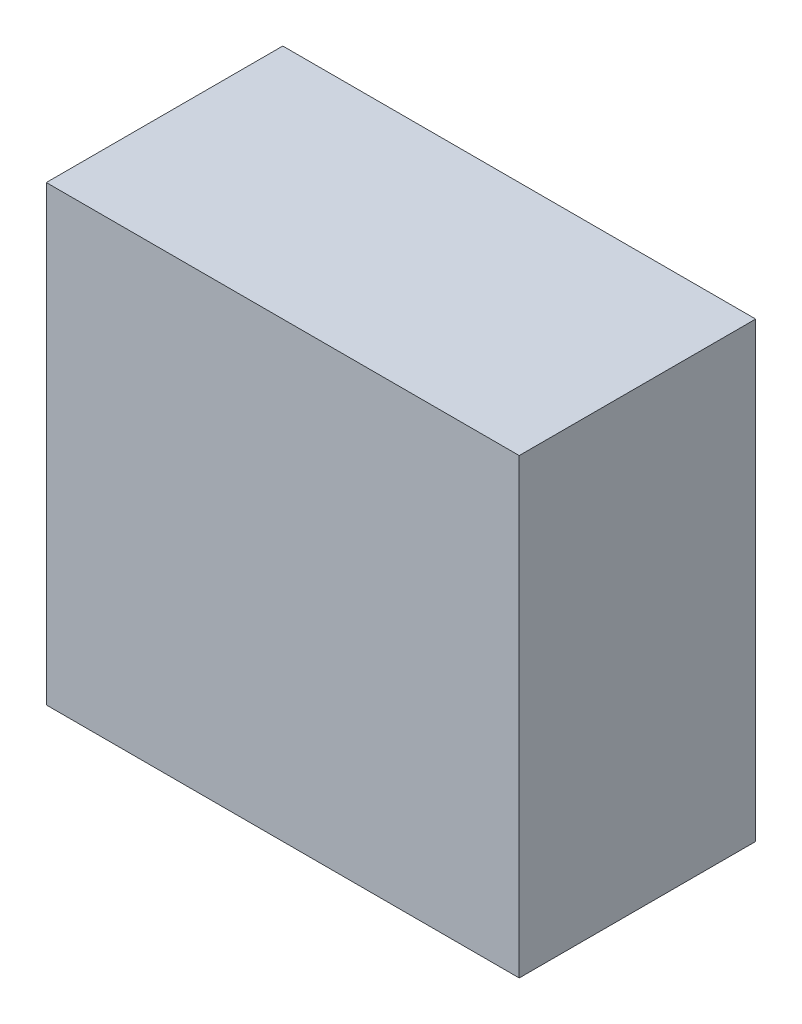
ISO-10303-21;
HEADER;
FILE_DESCRIPTION(('STEP AP214'),'2;1');
FILE_NAME('part.step','',(''),(''),'','','');
FILE_SCHEMA(('AUTOMOTIVE_DESIGN { 1 0 10303 214 1 1 1 1 }'));
ENDSEC;
DATA;
#1=APPLICATION_CONTEXT('core data for automotive mechanical design processes');
#2=APPLICATION_PROTOCOL_DEFINITION('international standard','automotive_design',2000,#1);
#3=PRODUCT_CONTEXT('',#1,'mechanical');
#4=PRODUCT('Part','Part','',(#3));
#5=PRODUCT_RELATED_PRODUCT_CATEGORY('part','',(#4));
#6=PRODUCT_DEFINITION_FORMATION('','',#4);
#7=PRODUCT_DEFINITION_CONTEXT('part definition',#1,'design');
#8=PRODUCT_DEFINITION('design','',#6,#7);
#9=PRODUCT_DEFINITION_SHAPE('','',#8);
#10=(LENGTH_UNIT() NAMED_UNIT(*) SI_UNIT(.MILLI.,.METRE.));
#11=(NAMED_UNIT(*) PLANE_ANGLE_UNIT() SI_UNIT($,.RADIAN.));
#12=(NAMED_UNIT(*) SI_UNIT($,.STERADIAN.) SOLID_ANGLE_UNIT());
#13=UNCERTAINTY_MEASURE_WITH_UNIT(LENGTH_MEASURE(1.E-05),#10,'distance_accuracy_value','');
#14=(GEOMETRIC_REPRESENTATION_CONTEXT(3) GLOBAL_UNCERTAINTY_ASSIGNED_CONTEXT((#13)) GLOBAL_UNIT_ASSIGNED_CONTEXT((#10,
#11,#12)) REPRESENTATION_CONTEXT('',''));
#15=CARTESIAN_POINT('',(0.,0.,0.));
#16=DIRECTION('',(0.,0.,1.));
#17=DIRECTION('',(1.,0.,0.));
#18=AXIS2_PLACEMENT_3D('',#15,#16,#17);
#19=CARTESIAN_POINT('',(25.4,24.3012525978542,25.4));
#20=DIRECTION('',(-1.,0.,0.));
#21=DIRECTION('',(0.,0.,1.));
#22=AXIS2_PLACEMENT_3D('',#19,#20,#21);
#23=PLANE('',#22);
#24=DIRECTION('',(0.,1.,0.));
#25=VECTOR('',#24,1.);
#26=CARTESIAN_POINT('',(25.4,24.3012525978542,0.));
#27=LINE('',#26,#25);
#28=CARTESIAN_POINT('',(25.4,-24.3012525978542,0.));
#29=VERTEX_POINT('',#28);
#30=CARTESIAN_POINT('',(25.4,24.3012525978542,0.));
#31=VERTEX_POINT('',#30);
#32=EDGE_CURVE('E100',#29,#31,#27,.T.);
#33=ORIENTED_EDGE('',*,*,#32,.T.);
#34=DIRECTION('',(0.,0.,-1.));
#35=VECTOR('',#34,1.);
#36=CARTESIAN_POINT('',(25.4,24.3012525978542,25.4));
#37=LINE('',#36,#35);
#38=CARTESIAN_POINT('',(25.4,24.3012525978542,25.4));
#39=VERTEX_POINT('',#38);
#40=EDGE_CURVE('E11',#39,#31,#37,.T.);
#41=ORIENTED_EDGE('',*,*,#40,.F.);
#42=DIRECTION('',(0.,1.,0.));
#43=VECTOR('',#42,1.);
#44=CARTESIAN_POINT('',(25.4,24.3012525978542,25.4));
#45=LINE('',#44,#43);
#46=CARTESIAN_POINT('',(25.4,-24.3012525978542,25.4));
#47=VERTEX_POINT('',#46);
#48=EDGE_CURVE('E88',#47,#39,#45,.T.);
#49=ORIENTED_EDGE('',*,*,#48,.F.);
#50=DIRECTION('',(0.,0.,-1.));
#51=VECTOR('',#50,1.);
#52=CARTESIAN_POINT('',(25.4,-24.3012525978542,25.4));
#53=LINE('',#52,#51);
#54=EDGE_CURVE('E96',#47,#29,#53,.T.);
#55=ORIENTED_EDGE('',*,*,#54,.T.);
#56=EDGE_LOOP('',(#33,#41,#49,#55));
#57=FACE_BOUND('',#56,.T.);
#58=ADVANCED_FACE('F37',(#57),#23,.F.);
#59=CARTESIAN_POINT('',(-25.4,24.3012525978542,25.4));
#60=DIRECTION('',(0.,-1.,0.));
#61=DIRECTION('',(0.,0.,-1.));
#62=AXIS2_PLACEMENT_3D('',#59,#60,#61);
#63=PLANE('',#62);
#64=DIRECTION('',(-1.,0.,0.));
#65=VECTOR('',#64,1.);
#66=CARTESIAN_POINT('',(-25.4,24.3012525978542,0.));
#67=LINE('',#66,#65);
#68=CARTESIAN_POINT('',(-25.4,24.3012525978542,0.));
#69=VERTEX_POINT('',#68);
#70=EDGE_CURVE('E92',#31,#69,#67,.T.);
#71=ORIENTED_EDGE('',*,*,#70,.T.);
#72=DIRECTION('',(0.,0.,-1.));
#73=VECTOR('',#72,1.);
#74=CARTESIAN_POINT('',(-25.4,24.3012525978542,25.4));
#75=LINE('',#74,#73);
#76=CARTESIAN_POINT('',(-25.4,24.3012525978542,25.4));
#77=VERTEX_POINT('',#76);
#78=EDGE_CURVE('E45',#77,#69,#75,.T.);
#79=ORIENTED_EDGE('',*,*,#78,.F.);
#80=DIRECTION('',(-1.,0.,0.));
#81=VECTOR('',#80,1.);
#82=CARTESIAN_POINT('',(-25.4,24.3012525978542,25.4));
#83=LINE('',#82,#81);
#84=EDGE_CURVE('E83',#39,#77,#83,.T.);
#85=ORIENTED_EDGE('',*,*,#84,.F.);
#86=ORIENTED_EDGE('',*,*,#40,.T.);
#87=EDGE_LOOP('',(#71,#79,#85,#86));
#88=FACE_BOUND('',#87,.T.);
#89=ADVANCED_FACE('F91',(#88),#63,.F.);
#90=CARTESIAN_POINT('',(-25.4,24.3012525978542,25.4));
#91=DIRECTION('',(1.,0.,0.));
#92=DIRECTION('',(0.,0.,-1.));
#93=AXIS2_PLACEMENT_3D('',#90,#91,#92);
#94=PLANE('',#93);
#95=DIRECTION('',(0.,-1.,0.));
#96=VECTOR('',#95,1.);
#97=CARTESIAN_POINT('',(-25.4,24.3012525978542,0.));
#98=LINE('',#97,#96);
#99=CARTESIAN_POINT('',(-25.4,-24.3012525978542,0.));
#100=VERTEX_POINT('',#99);
#101=EDGE_CURVE('E70',#69,#100,#98,.T.);
#102=ORIENTED_EDGE('',*,*,#101,.T.);
#103=DIRECTION('',(0.,0.,-1.));
#104=VECTOR('',#103,1.);
#105=CARTESIAN_POINT('',(-25.4,-24.3012525978542,25.4));
#106=LINE('',#105,#104);
#107=CARTESIAN_POINT('',(-25.4,-24.3012525978542,25.4));
#108=VERTEX_POINT('',#107);
#109=EDGE_CURVE('E93',#108,#100,#106,.T.);
#110=ORIENTED_EDGE('',*,*,#109,.F.);
#111=DIRECTION('',(0.,-1.,0.));
#112=VECTOR('',#111,1.);
#113=CARTESIAN_POINT('',(-25.4,24.3012525978542,25.4));
#114=LINE('',#113,#112);
#115=EDGE_CURVE('E86',#77,#108,#114,.T.);
#116=ORIENTED_EDGE('',*,*,#115,.F.);
#117=ORIENTED_EDGE('',*,*,#78,.T.);
#118=EDGE_LOOP('',(#102,#110,#116,#117));
#119=FACE_BOUND('',#118,.T.);
#120=ADVANCED_FACE('F94',(#119),#94,.F.);
#121=CARTESIAN_POINT('',(-25.4,-24.3012525978542,25.4));
#122=DIRECTION('',(0.,1.,0.));
#123=DIRECTION('',(0.,0.,1.));
#124=AXIS2_PLACEMENT_3D('',#121,#122,#123);
#125=PLANE('',#124);
#126=DIRECTION('',(1.,0.,0.));
#127=VECTOR('',#126,1.);
#128=CARTESIAN_POINT('',(-25.4,-24.3012525978542,0.));
#129=LINE('',#128,#127);
#130=EDGE_CURVE('E76',#100,#29,#129,.T.);
#131=ORIENTED_EDGE('',*,*,#130,.T.);
#132=ORIENTED_EDGE('',*,*,#54,.F.);
#133=DIRECTION('',(1.,0.,0.));
#134=VECTOR('',#133,1.);
#135=CARTESIAN_POINT('',(-25.4,-24.3012525978542,25.4));
#136=LINE('',#135,#134);
#137=EDGE_CURVE('E53',#108,#47,#136,.T.);
#138=ORIENTED_EDGE('',*,*,#137,.F.);
#139=ORIENTED_EDGE('',*,*,#109,.T.);
#140=EDGE_LOOP('',(#131,#132,#138,#139));
#141=FACE_BOUND('',#140,.T.);
#142=ADVANCED_FACE('F107',(#141),#125,.F.);
#143=CARTESIAN_POINT('',(0.,0.,25.4));
#144=DIRECTION('',(0.,0.,1.));
#145=DIRECTION('',(1.,0.,0.));
#146=AXIS2_PLACEMENT_3D('',#143,#144,#145);
#147=PLANE('',#146);
#148=ORIENTED_EDGE('',*,*,#48,.T.);
#149=ORIENTED_EDGE('',*,*,#84,.T.);
#150=ORIENTED_EDGE('',*,*,#115,.T.);
#151=ORIENTED_EDGE('',*,*,#137,.T.);
#152=EDGE_LOOP('',(#148,#149,#150,#151));
#153=FACE_BOUND('',#152,.T.);
#154=ADVANCED_FACE('F84',(#153),#147,.T.);
#155=CARTESIAN_POINT('',(0.,0.,0.));
#156=DIRECTION('',(0.,0.,1.));
#157=DIRECTION('',(1.,0.,0.));
#158=AXIS2_PLACEMENT_3D('',#155,#156,#157);
#159=PLANE('',#158);
#160=ORIENTED_EDGE('',*,*,#32,.F.);
#161=ORIENTED_EDGE('',*,*,#130,.F.);
#162=ORIENTED_EDGE('',*,*,#101,.F.);
#163=ORIENTED_EDGE('',*,*,#70,.F.);
#164=EDGE_LOOP('',(#160,#161,#162,#163));
#165=FACE_BOUND('',#164,.T.);
#166=ADVANCED_FACE('F110',(#165),#159,.F.);
#167=CLOSED_SHELL('',(#58,#89,#120,#142,#154,#166));
#168=MANIFOLD_SOLID_BREP('B2',#167);
#169=ADVANCED_BREP_SHAPE_REPRESENTATION('',(#18,#168),#14);
#170=SHAPE_DEFINITION_REPRESENTATION(#9,#169);
ENDSEC;
END-ISO-10303-21;
